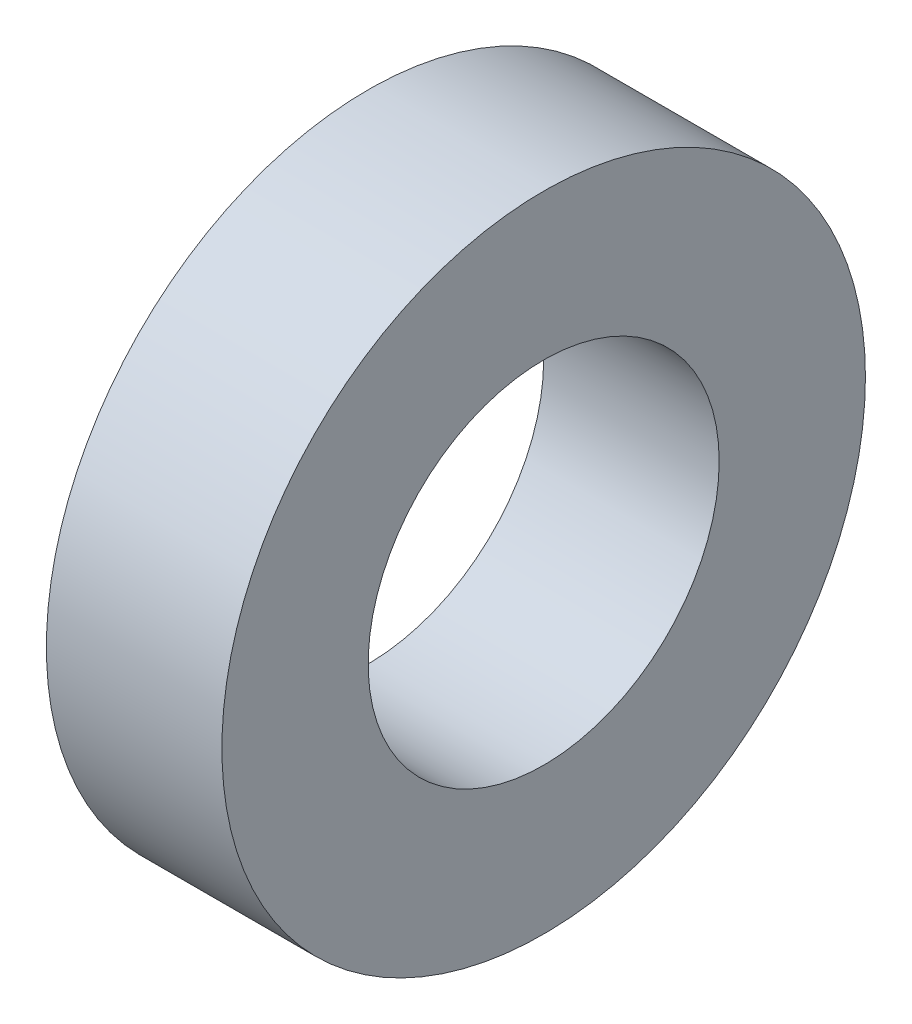
ISO-10303-21;
HEADER;
FILE_DESCRIPTION(('STEP AP214'),'2;1');
FILE_NAME('part.step','',(''),(''),'','','');
FILE_SCHEMA(('AUTOMOTIVE_DESIGN { 1 0 10303 214 1 1 1 1 }'));
ENDSEC;
DATA;
#1=APPLICATION_CONTEXT('core data for automotive mechanical design processes');
#2=APPLICATION_PROTOCOL_DEFINITION('international standard','automotive_design',2000,#1);
#3=PRODUCT_CONTEXT('',#1,'mechanical');
#4=PRODUCT('Part','Part','',(#3));
#5=PRODUCT_RELATED_PRODUCT_CATEGORY('part','',(#4));
#6=PRODUCT_DEFINITION_FORMATION('','',#4);
#7=PRODUCT_DEFINITION_CONTEXT('part definition',#1,'design');
#8=PRODUCT_DEFINITION('design','',#6,#7);
#9=PRODUCT_DEFINITION_SHAPE('','',#8);
#10=(LENGTH_UNIT() NAMED_UNIT(*) SI_UNIT(.MILLI.,.METRE.));
#11=(NAMED_UNIT(*) PLANE_ANGLE_UNIT() SI_UNIT($,.RADIAN.));
#12=(NAMED_UNIT(*) SI_UNIT($,.STERADIAN.) SOLID_ANGLE_UNIT());
#13=UNCERTAINTY_MEASURE_WITH_UNIT(LENGTH_MEASURE(1.E-05),#10,'distance_accuracy_value','');
#14=(GEOMETRIC_REPRESENTATION_CONTEXT(3) GLOBAL_UNCERTAINTY_ASSIGNED_CONTEXT((#13)) GLOBAL_UNIT_ASSIGNED_CONTEXT((#10,
#11,#12)) REPRESENTATION_CONTEXT('',''));
#15=CARTESIAN_POINT('',(0.,0.,0.));
#16=DIRECTION('',(0.,0.,1.));
#17=DIRECTION('',(1.,0.,0.));
#18=AXIS2_PLACEMENT_3D('',#15,#16,#17);
#19=CARTESIAN_POINT('',(3.,0.,0.));
#20=DIRECTION('',(1.,0.,0.));
#21=DIRECTION('',(0.,0.,-1.));
#22=AXIS2_PLACEMENT_3D('',#19,#20,#21);
#23=PLANE('',#22);
#24=CARTESIAN_POINT('',(3.,0.,0.));
#25=DIRECTION('',(1.,0.,0.));
#26=DIRECTION('',(0.,0.,-1.));
#27=AXIS2_PLACEMENT_3D('',#24,#25,#26);
#28=CIRCLE('',#27,5.5);
#29=CARTESIAN_POINT('',(3.,0.,-5.5));
#30=VERTEX_POINT('',#29);
#31=EDGE_CURVE('E10',#30,#30,#28,.T.);
#32=ORIENTED_EDGE('',*,*,#31,.T.);
#33=EDGE_LOOP('',(#32));
#34=FACE_BOUND('',#33,.T.);
#35=CARTESIAN_POINT('',(3.,0.,0.));
#36=DIRECTION('',(1.,0.,0.));
#37=DIRECTION('',(0.,0.,-1.));
#38=AXIS2_PLACEMENT_3D('',#35,#36,#37);
#39=CIRCLE('',#38,3.);
#40=CARTESIAN_POINT('',(3.,0.,-3.));
#41=VERTEX_POINT('',#40);
#42=EDGE_CURVE('E44',#41,#41,#39,.T.);
#43=ORIENTED_EDGE('',*,*,#42,.F.);
#44=EDGE_LOOP('',(#43));
#45=FACE_BOUND('',#44,.T.);
#46=ADVANCED_FACE('F33',(#34,#45),#23,.T.);
#47=CARTESIAN_POINT('',(0.,0.,0.));
#48=DIRECTION('',(1.,0.,0.));
#49=DIRECTION('',(0.,0.,-1.));
#50=AXIS2_PLACEMENT_3D('',#47,#48,#49);
#51=PLANE('',#50);
#52=CARTESIAN_POINT('',(0.,0.,0.));
#53=DIRECTION('',(1.,0.,0.));
#54=DIRECTION('',(0.,0.,-1.));
#55=AXIS2_PLACEMENT_3D('',#52,#53,#54);
#56=CIRCLE('',#55,5.5);
#57=CARTESIAN_POINT('',(0.,0.,-5.5));
#58=VERTEX_POINT('',#57);
#59=EDGE_CURVE('E37',#58,#58,#56,.T.);
#60=ORIENTED_EDGE('',*,*,#59,.F.);
#61=EDGE_LOOP('',(#60));
#62=FACE_BOUND('',#61,.T.);
#63=CARTESIAN_POINT('',(0.,0.,0.));
#64=DIRECTION('',(1.,0.,0.));
#65=DIRECTION('',(0.,0.,-1.));
#66=AXIS2_PLACEMENT_3D('',#63,#64,#65);
#67=CIRCLE('',#66,3.);
#68=CARTESIAN_POINT('',(0.,0.,-3.));
#69=VERTEX_POINT('',#68);
#70=EDGE_CURVE('E46',#69,#69,#67,.T.);
#71=ORIENTED_EDGE('',*,*,#70,.T.);
#72=EDGE_LOOP('',(#71));
#73=FACE_BOUND('',#72,.T.);
#74=ADVANCED_FACE('F56',(#62,#73),#51,.F.);
#75=CARTESIAN_POINT('',(3.,0.,0.));
#76=DIRECTION('',(-1.,0.,0.));
#77=DIRECTION('',(0.,0.,1.));
#78=AXIS2_PLACEMENT_3D('',#75,#76,#77);
#79=CYLINDRICAL_SURFACE('',#78,5.5);
#80=ORIENTED_EDGE('',*,*,#31,.F.);
#81=EDGE_LOOP('',(#80));
#82=FACE_BOUND('',#81,.T.);
#83=ORIENTED_EDGE('',*,*,#59,.T.);
#84=EDGE_LOOP('',(#83));
#85=FACE_BOUND('',#84,.T.);
#86=ADVANCED_FACE('F35',(#82,#85),#79,.T.);
#87=CARTESIAN_POINT('',(3.,0.,0.));
#88=DIRECTION('',(-1.,0.,0.));
#89=DIRECTION('',(0.,0.,1.));
#90=AXIS2_PLACEMENT_3D('',#87,#88,#89);
#91=CYLINDRICAL_SURFACE('',#90,3.);
#92=ORIENTED_EDGE('',*,*,#42,.T.);
#93=EDGE_LOOP('',(#92));
#94=FACE_BOUND('',#93,.T.);
#95=ORIENTED_EDGE('',*,*,#70,.F.);
#96=EDGE_LOOP('',(#95));
#97=FACE_BOUND('',#96,.T.);
#98=ADVANCED_FACE('F52',(#94,#97),#91,.F.);
#99=CLOSED_SHELL('',(#46,#74,#86,#98));
#100=MANIFOLD_SOLID_BREP('B2',#99);
#101=ADVANCED_BREP_SHAPE_REPRESENTATION('',(#18,#100),#14);
#102=SHAPE_DEFINITION_REPRESENTATION(#9,#101);
ENDSEC;
END-ISO-10303-21;
